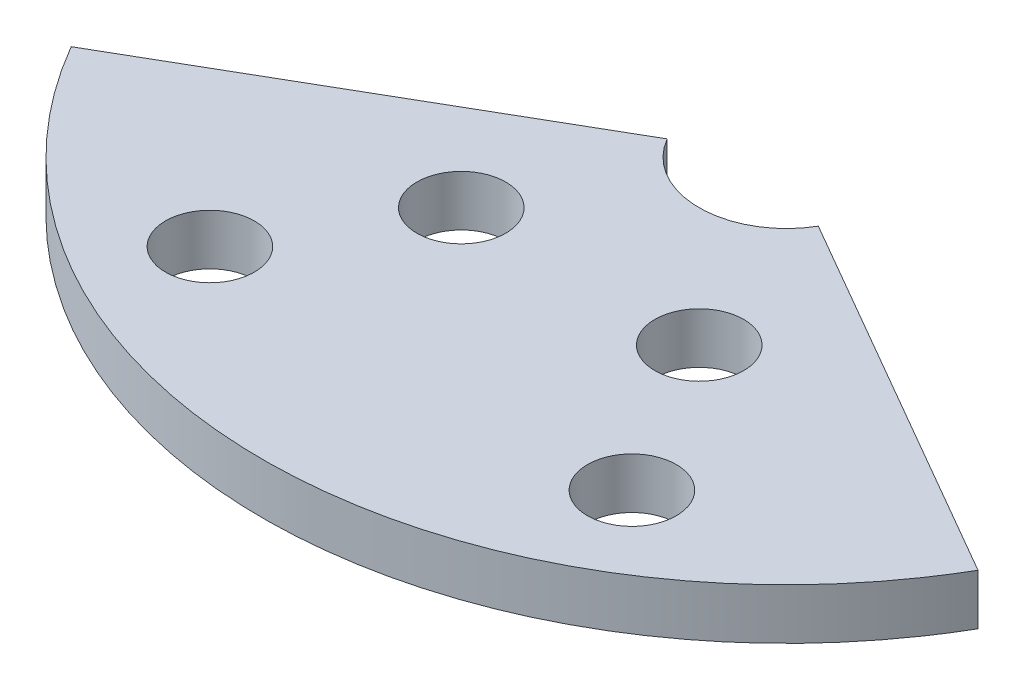
ISO-10303-21;
HEADER;
FILE_DESCRIPTION(('STEP AP214'),'2;1');
FILE_NAME('part.step','',(''),(''),'','','');
FILE_SCHEMA(('AUTOMOTIVE_DESIGN { 1 0 10303 214 1 1 1 1 }'));
ENDSEC;
DATA;
#1=APPLICATION_CONTEXT('core data for automotive mechanical design processes');
#2=APPLICATION_PROTOCOL_DEFINITION('international standard','automotive_design',2000,#1);
#3=PRODUCT_CONTEXT('',#1,'mechanical');
#4=PRODUCT('Part','Part','',(#3));
#5=PRODUCT_RELATED_PRODUCT_CATEGORY('part','',(#4));
#6=PRODUCT_DEFINITION_FORMATION('','',#4);
#7=PRODUCT_DEFINITION_CONTEXT('part definition',#1,'design');
#8=PRODUCT_DEFINITION('design','',#6,#7);
#9=PRODUCT_DEFINITION_SHAPE('','',#8);
#10=(LENGTH_UNIT() NAMED_UNIT(*) SI_UNIT(.MILLI.,.METRE.));
#11=(NAMED_UNIT(*) PLANE_ANGLE_UNIT() SI_UNIT($,.RADIAN.));
#12=(NAMED_UNIT(*) SI_UNIT($,.STERADIAN.) SOLID_ANGLE_UNIT());
#13=UNCERTAINTY_MEASURE_WITH_UNIT(LENGTH_MEASURE(1.E-05),#10,'distance_accuracy_value','');
#14=(GEOMETRIC_REPRESENTATION_CONTEXT(3) GLOBAL_UNCERTAINTY_ASSIGNED_CONTEXT((#13)) GLOBAL_UNIT_ASSIGNED_CONTEXT((#10,
#11,#12)) REPRESENTATION_CONTEXT('',''));
#15=CARTESIAN_POINT('',(0.,0.,0.));
#16=DIRECTION('',(0.,0.,1.));
#17=DIRECTION('',(1.,0.,0.));
#18=AXIS2_PLACEMENT_3D('',#15,#16,#17);
#19=CARTESIAN_POINT('',(0.,-6.744,0.));
#20=DIRECTION('',(0.,1.,0.));
#21=DIRECTION('',(-1.,0.,0.));
#22=AXIS2_PLACEMENT_3D('',#19,#20,#21);
#23=CYLINDRICAL_SURFACE('',#22,13.7501305084715);
#24=CARTESIAN_POINT('',(0.,1.256,0.));
#25=DIRECTION('',(0.,1.,0.));
#26=DIRECTION('',(-1.,0.,0.));
#27=AXIS2_PLACEMENT_3D('',#24,#25,#26);
#28=CIRCLE('',#27,13.7501305084715);
#29=CARTESIAN_POINT('',(-11.9079583334281,1.256,6.87507216902783));
#30=VERTEX_POINT('',#29);
#31=CARTESIAN_POINT('',(11.9079583334518,1.256,6.87507216898668));
#32=VERTEX_POINT('',#31);
#33=EDGE_CURVE('E111',#30,#32,#28,.T.);
#34=ORIENTED_EDGE('',*,*,#33,.T.);
#35=DIRECTION('',(0.,1.,0.));
#36=VECTOR('',#35,1.);
#37=CARTESIAN_POINT('',(11.9079583334518,-6.744,6.87507216898668));
#38=LINE('',#37,#36);
#39=CARTESIAN_POINT('',(11.9079583334518,-6.744,6.87507216898668));
#40=VERTEX_POINT('',#39);
#41=EDGE_CURVE('E11',#40,#32,#38,.T.);
#42=ORIENTED_EDGE('',*,*,#41,.F.);
#43=CARTESIAN_POINT('',(0.,-6.744,0.));
#44=DIRECTION('',(0.,1.,0.));
#45=DIRECTION('',(-1.,0.,0.));
#46=AXIS2_PLACEMENT_3D('',#43,#44,#45);
#47=CIRCLE('',#46,13.7501305084715);
#48=CARTESIAN_POINT('',(-11.9079583334281,-6.744,6.87507216902783));
#49=VERTEX_POINT('',#48);
#50=EDGE_CURVE('E80',#49,#40,#47,.T.);
#51=ORIENTED_EDGE('',*,*,#50,.F.);
#52=DIRECTION('',(0.,1.,0.));
#53=VECTOR('',#52,1.);
#54=CARTESIAN_POINT('',(-11.9079583334281,-6.744,6.87507216902783));
#55=LINE('',#54,#53);
#56=EDGE_CURVE('E47',#49,#30,#55,.T.);
#57=ORIENTED_EDGE('',*,*,#56,.T.);
#58=EDGE_LOOP('',(#34,#42,#51,#57));
#59=FACE_BOUND('',#58,.T.);
#60=ADVANCED_FACE('F31',(#59),#23,.F.);
#61=CARTESIAN_POINT('',(11.9079583334518,-6.744,6.87507216898668));
#62=DIRECTION('',(-0.500000502885533,0.,0.866025113443146));
#63=DIRECTION('',(0.866025113443146,0.,0.500000502885533));
#64=AXIS2_PLACEMENT_3D('',#61,#62,#63);
#65=PLANE('',#64);
#66=DIRECTION('',(0.866025113443146,0.,0.500000502885533));
#67=VECTOR('',#66,1.);
#68=CARTESIAN_POINT('',(11.9079583334518,1.256,6.87507216898668));
#69=LINE('',#68,#67);
#70=CARTESIAN_POINT('',(71.4469146029727,1.25600000000001,41.2499506961029));
#71=VERTEX_POINT('',#70);
#72=EDGE_CURVE('E85',#32,#71,#69,.T.);
#73=ORIENTED_EDGE('',*,*,#72,.T.);
#74=DIRECTION('',(0.,1.,0.));
#75=VECTOR('',#74,1.);
#76=CARTESIAN_POINT('',(71.4469146029727,-6.74399999999999,41.2499506961029));
#77=LINE('',#76,#75);
#78=CARTESIAN_POINT('',(71.4469146029727,-6.74399999999999,41.2499506961029));
#79=VERTEX_POINT('',#78);
#80=EDGE_CURVE('E39',#79,#71,#77,.T.);
#81=ORIENTED_EDGE('',*,*,#80,.F.);
#82=DIRECTION('',(0.866025113443146,0.,0.500000502885533));
#83=VECTOR('',#82,1.);
#84=CARTESIAN_POINT('',(11.9079583334518,-6.744,6.87507216898668));
#85=LINE('',#84,#83);
#86=EDGE_CURVE('E72',#40,#79,#85,.T.);
#87=ORIENTED_EDGE('',*,*,#86,.F.);
#88=ORIENTED_EDGE('',*,*,#41,.T.);
#89=EDGE_LOOP('',(#73,#81,#87,#88));
#90=FACE_BOUND('',#89,.T.);
#91=ADVANCED_FACE('F84',(#90),#65,.F.);
#92=CARTESIAN_POINT('',(-71.4471176254403,-6.74400000000001,41.2500679081568));
#93=CARTESIAN_POINT('',(-71.3661601771251,-6.74400000000001,41.3902861155633));
#94=CARTESIAN_POINT('',(-70.3091616544968,-6.744,43.2085444675748));
#95=CARTESIAN_POINT('',(-68.1420010306818,-6.744,46.6264076369609));
#96=CARTESIAN_POINT('',(-64.6850825574709,-6.744,51.3179603314155));
#97=CARTESIAN_POINT('',(-60.9033093758443,-6.744,55.7522030200757));
#98=CARTESIAN_POINT('',(-56.8191451499,-6.744,59.9098103839806));
#99=CARTESIAN_POINT('',(-52.4517263648933,-6.744,63.768931064706));
#100=CARTESIAN_POINT('',(-47.822687052309,-6.744,67.30986258579));
#101=CARTESIAN_POINT('',(-42.9556133815968,-6.744,70.515547404472));
#102=CARTESIAN_POINT('',(-37.8747792068427,-6.744,73.3700076913245));
#103=CARTESIAN_POINT('',(-32.6045145678455,-6.744,75.8577645515811));
#104=CARTESIAN_POINT('',(-27.1728427633841,-6.744,77.9699279752762));
#105=CARTESIAN_POINT('',(-21.6048219411377,-6.744,79.6922881272113));
#106=CARTESIAN_POINT('',(-15.9295841311975,-6.744,81.0170047138531));
#107=CARTESIAN_POINT('',(-10.1750273860372,-6.744,81.9392518811265));
#108=CARTESIAN_POINT('',(-4.36985543928022,-6.744,82.4522864580724));
#109=CARTESIAN_POINT('',(1.45727600922675,-6.744,82.5555529907772));
#110=CARTESIAN_POINT('',(7.27716254939578,-6.744,82.2474824649832));
#111=CARTESIAN_POINT('',(13.0604419052198,-6.74399999999999,81.5285005086178));
#112=CARTESIAN_POINT('',(18.7791430058164,-6.74399999999999,80.4048084369535));
#113=CARTESIAN_POINT('',(24.4037476155964,-6.74399999999999,78.8796274218153));
#114=CARTESIAN_POINT('',(29.9069558527534,-6.74399999999999,76.9615929650851));
#115=CARTESIAN_POINT('',(35.2616139170664,-6.74399999999999,74.6615175656854));
#116=CARTESIAN_POINT('',(40.439320096809,-6.74399999999999,71.9859947428277));
#117=CARTESIAN_POINT('',(45.4178044007229,-6.74399999999999,68.9561290954584));
#118=CARTESIAN_POINT('',(50.1675817506521,-6.74399999999999,65.578718514889));
#119=CARTESIAN_POINT('',(54.6694319325816,-6.74399999999999,61.877793260476));
#120=CARTESIAN_POINT('',(58.8978064634218,-6.74399999999999,57.866905616755));
#121=CARTESIAN_POINT('',(62.8333405564802,-6.74399999999999,53.5685725964528));
#122=CARTESIAN_POINT('',(66.4548477985682,-6.74399999999999,49.0028018639444));
#123=CARTESIAN_POINT('',(69.2891848353224,-6.74399999999999,44.861425580242));
#124=CARTESIAN_POINT('',(70.880649196064,-6.74399999999999,42.230909650586));
#125=CARTESIAN_POINT('',(71.4469146029727,-6.74399999999999,41.2499506961029));
#126=B_SPLINE_CURVE_WITH_KNOTS('',3,(#92,#93,#94,#95,#96,#97,#98,#99,#100,#101,#102,#103,#104,
#105,#106,#107,#108,#109,#110,#111,#112,#113,#114,#115,#116,#117,#118,#119,#120,#121,#122,#123,
#124,#125),.UNSPECIFIED.,.F.,.F.,(4,1,1,1,1,1,1,1,1,1,1,1,1,1,1,1,1,1,1,1,1,1,1,1,1,1,1,1,1,1,1,
4),(0.,0.00281118504864708,0.0365160998991901,0.0702222977075216,0.10392951498759,
0.137638338705647,0.171348631114215,0.205056357373021,0.238764038400629,0.272472641436815,
0.306176566075001,0.339887878328473,0.373595972896201,0.407306257849649,0.441009596399646,
0.474720653197788,0.508427496691702,0.542135729933407,0.575845591433321,0.609549057243366,
0.643261827145568,0.676965075221332,0.710672717976341,0.744381334432411,0.778092762485036,
0.811797295570405,0.845508270363994,0.879215303236783,0.912922820735709,0.946631012226169,
0.980334215064725,1.),.UNSPECIFIED.);
#127=DIRECTION('',(0.,1.,0.));
#128=VECTOR('',#127,1.);
#129=SURFACE_OF_LINEAR_EXTRUSION('',#126,#128);
#130=CARTESIAN_POINT('',(-71.4471176254403,1.256,41.2500679081568));
#131=CARTESIAN_POINT('',(-71.3661601771251,1.256,41.3902861155633));
#132=CARTESIAN_POINT('',(-70.3091616544968,1.256,43.2085444675748));
#133=CARTESIAN_POINT('',(-68.1420010306818,1.256,46.6264076369609));
#134=CARTESIAN_POINT('',(-64.6850825574709,1.256,51.3179603314155));
#135=CARTESIAN_POINT('',(-60.9033093758443,1.256,55.7522030200757));
#136=CARTESIAN_POINT('',(-56.8191451499,1.256,59.9098103839806));
#137=CARTESIAN_POINT('',(-52.4517263648933,1.256,63.768931064706));
#138=CARTESIAN_POINT('',(-47.822687052309,1.256,67.30986258579));
#139=CARTESIAN_POINT('',(-42.9556133815968,1.256,70.515547404472));
#140=CARTESIAN_POINT('',(-37.8747792068427,1.256,73.3700076913245));
#141=CARTESIAN_POINT('',(-32.6045145678455,1.256,75.8577645515811));
#142=CARTESIAN_POINT('',(-27.1728427633841,1.256,77.9699279752762));
#143=CARTESIAN_POINT('',(-21.6048219411377,1.256,79.6922881272113));
#144=CARTESIAN_POINT('',(-15.9295841311975,1.256,81.0170047138531));
#145=CARTESIAN_POINT('',(-10.1750273860372,1.256,81.9392518811265));
#146=CARTESIAN_POINT('',(-4.36985543928022,1.256,82.4522864580724));
#147=CARTESIAN_POINT('',(1.45727600922675,1.256,82.5555529907772));
#148=CARTESIAN_POINT('',(7.27716254939578,1.256,82.2474824649832));
#149=CARTESIAN_POINT('',(13.0604419052198,1.25600000000001,81.5285005086178));
#150=CARTESIAN_POINT('',(18.7791430058164,1.25600000000001,80.4048084369535));
#151=CARTESIAN_POINT('',(24.4037476155964,1.25600000000001,78.8796274218153));
#152=CARTESIAN_POINT('',(29.9069558527534,1.25600000000001,76.9615929650851));
#153=CARTESIAN_POINT('',(35.2616139170664,1.25600000000001,74.6615175656854));
#154=CARTESIAN_POINT('',(40.439320096809,1.25600000000001,71.9859947428277));
#155=CARTESIAN_POINT('',(45.4178044007229,1.25600000000001,68.9561290954584));
#156=CARTESIAN_POINT('',(50.1675817506521,1.25600000000001,65.578718514889));
#157=CARTESIAN_POINT('',(54.6694319325816,1.25600000000001,61.877793260476));
#158=CARTESIAN_POINT('',(58.8978064634218,1.25600000000001,57.866905616755));
#159=CARTESIAN_POINT('',(62.8333405564802,1.25600000000001,53.5685725964528));
#160=CARTESIAN_POINT('',(66.4548477985682,1.25600000000001,49.0028018639444));
#161=CARTESIAN_POINT('',(69.2891848353224,1.25600000000001,44.861425580242));
#162=CARTESIAN_POINT('',(70.880649196064,1.25600000000001,42.230909650586));
#163=CARTESIAN_POINT('',(71.4469146029727,1.25600000000001,41.2499506961029));
#164=B_SPLINE_CURVE_WITH_KNOTS('',3,(#130,#131,#132,#133,#134,#135,#136,#137,#138,#139,#140,
#141,#142,#143,#144,#145,#146,#147,#148,#149,#150,#151,#152,#153,#154,#155,#156,#157,#158,#159,
#160,#161,#162,#163),.UNSPECIFIED.,.F.,.F.,(4,1,1,1,1,1,1,1,1,1,1,1,1,1,1,1,1,1,1,1,1,1,1,1,1,1,
1,1,1,1,1,4),(0.,0.00281118504864708,0.0365160998991901,0.0702222977075216,0.10392951498759,
0.137638338705647,0.171348631114215,0.205056357373021,0.238764038400629,0.272472641436815,
0.306176566075001,0.339887878328473,0.373595972896201,0.407306257849649,0.441009596399646,
0.474720653197788,0.508427496691702,0.542135729933407,0.575845591433321,0.609549057243366,
0.643261827145568,0.676965075221332,0.710672717976341,0.744381334432411,0.778092762485036,
0.811797295570405,0.845508270363994,0.879215303236783,0.912922820735709,0.946631012226169,
0.980334215064725,1.),.UNSPECIFIED.);
#165=CARTESIAN_POINT('',(-71.4471176254403,1.256,41.2500679081568));
#166=VERTEX_POINT('',#165);
#167=EDGE_CURVE('E115',#166,#71,#164,.T.);
#168=ORIENTED_EDGE('',*,*,#167,.F.);
#169=DIRECTION('',(0.,1.,0.));
#170=VECTOR('',#169,1.);
#171=CARTESIAN_POINT('',(-71.4471176254403,-6.74400000000001,41.2500679081568));
#172=LINE('',#171,#170);
#173=CARTESIAN_POINT('',(-71.4471176254403,-6.74400000000001,41.2500679081568));
#174=VERTEX_POINT('',#173);
#175=EDGE_CURVE('E61',#174,#166,#172,.T.);
#176=ORIENTED_EDGE('',*,*,#175,.F.);
#177=EDGE_CURVE('E79',#174,#79,#126,.T.);
#178=ORIENTED_EDGE('',*,*,#177,.T.);
#179=ORIENTED_EDGE('',*,*,#80,.T.);
#180=EDGE_LOOP('',(#168,#176,#178,#179));
#181=FACE_BOUND('',#180,.T.);
#182=ADVANCED_FACE('F88',(#181),#129,.T.);
#183=CARTESIAN_POINT('',(-11.9079583334281,-6.744,6.87507216902783));
#184=DIRECTION('',(-0.500000502850248,0.,-0.866025113463518));
#185=DIRECTION('',(-0.866025113463518,0.,0.500000502850248));
#186=AXIS2_PLACEMENT_3D('',#183,#184,#185);
#187=PLANE('',#186);
#188=DIRECTION('',(-0.866025113463518,0.,0.500000502850248));
#189=VECTOR('',#188,1.);
#190=CARTESIAN_POINT('',(-11.9079583334281,1.256,6.87507216902783));
#191=LINE('',#190,#189);
#192=EDGE_CURVE('E124',#30,#166,#191,.T.);
#193=ORIENTED_EDGE('',*,*,#192,.F.);
#194=ORIENTED_EDGE('',*,*,#56,.F.);
#195=DIRECTION('',(-0.866025113463518,0.,0.500000502850248));
#196=VECTOR('',#195,1.);
#197=CARTESIAN_POINT('',(-11.9079583334281,-6.744,6.87507216902783));
#198=LINE('',#197,#196);
#199=EDGE_CURVE('E89',#49,#174,#198,.T.);
#200=ORIENTED_EDGE('',*,*,#199,.T.);
#201=ORIENTED_EDGE('',*,*,#175,.T.);
#202=EDGE_LOOP('',(#193,#194,#200,#201));
#203=FACE_BOUND('',#202,.T.);
#204=ADVANCED_FACE('F103',(#203),#187,.T.);
#205=CARTESIAN_POINT('',(0.,-6.744,0.));
#206=DIRECTION('',(0.,1.,0.));
#207=DIRECTION('',(-1.,0.,0.));
#208=AXIS2_PLACEMENT_3D('',#205,#206,#207);
#209=PLANE('',#208);
#210=CARTESIAN_POINT('',(33.25,-6.74399999999999,57.591));
#211=DIRECTION('',(0.,1.,0.));
#212=DIRECTION('',(-1.,0.,0.));
#213=AXIS2_PLACEMENT_3D('',#210,#211,#212);
#214=CIRCLE('',#213,6.99984599830595);
#215=CARTESIAN_POINT('',(26.250154001694,-6.74399999999999,57.591));
#216=VERTEX_POINT('',#215);
#217=EDGE_CURVE('E143',#216,#216,#214,.T.);
#218=ORIENTED_EDGE('',*,*,#217,.T.);
#219=EDGE_LOOP('',(#218));
#220=FACE_BOUND('',#219,.T.);
#221=CARTESIAN_POINT('',(18.75,-6.744,32.476));
#222=DIRECTION('',(0.,1.,0.));
#223=DIRECTION('',(-1.,0.,0.));
#224=AXIS2_PLACEMENT_3D('',#221,#222,#223);
#225=CIRCLE('',#224,6.99984599830597);
#226=CARTESIAN_POINT('',(11.750154001694,-6.744,32.476));
#227=VERTEX_POINT('',#226);
#228=EDGE_CURVE('E137',#227,#227,#225,.T.);
#229=ORIENTED_EDGE('',*,*,#228,.T.);
#230=EDGE_LOOP('',(#229));
#231=FACE_BOUND('',#230,.T.);
#232=CARTESIAN_POINT('',(-33.25,-6.744,57.591));
#233=DIRECTION('',(0.,1.,0.));
#234=DIRECTION('',(-1.,0.,0.));
#235=AXIS2_PLACEMENT_3D('',#232,#233,#234);
#236=CIRCLE('',#235,6.99984599830596);
#237=CARTESIAN_POINT('',(-40.249845998306,-6.744,57.591));
#238=VERTEX_POINT('',#237);
#239=EDGE_CURVE('E132',#238,#238,#236,.T.);
#240=ORIENTED_EDGE('',*,*,#239,.T.);
#241=EDGE_LOOP('',(#240));
#242=FACE_BOUND('',#241,.T.);
#243=CARTESIAN_POINT('',(-18.75,-6.744,32.476));
#244=DIRECTION('',(0.,1.,0.));
#245=DIRECTION('',(-1.,0.,0.));
#246=AXIS2_PLACEMENT_3D('',#243,#244,#245);
#247=CIRCLE('',#246,6.99984599830597);
#248=CARTESIAN_POINT('',(-25.749845998306,-6.744,32.476));
#249=VERTEX_POINT('',#248);
#250=EDGE_CURVE('E114',#249,#249,#247,.T.);
#251=ORIENTED_EDGE('',*,*,#250,.T.);
#252=EDGE_LOOP('',(#251));
#253=FACE_BOUND('',#252,.T.);
#254=ORIENTED_EDGE('',*,*,#50,.T.);
#255=ORIENTED_EDGE('',*,*,#86,.T.);
#256=ORIENTED_EDGE('',*,*,#177,.F.);
#257=ORIENTED_EDGE('',*,*,#199,.F.);
#258=EDGE_LOOP('',(#254,#255,#256,#257));
#259=FACE_BOUND('',#258,.T.);
#260=ADVANCED_FACE('F76',(#220,#231,#242,#253,#259),#209,.F.);
#261=CARTESIAN_POINT('',(0.,1.256,0.));
#262=DIRECTION('',(0.,1.,0.));
#263=DIRECTION('',(-1.,0.,0.));
#264=AXIS2_PLACEMENT_3D('',#261,#262,#263);
#265=PLANE('',#264);
#266=CARTESIAN_POINT('',(33.25,1.25600000000001,57.591));
#267=DIRECTION('',(0.,1.,0.));
#268=DIRECTION('',(-1.,0.,0.));
#269=AXIS2_PLACEMENT_3D('',#266,#267,#268);
#270=CIRCLE('',#269,6.99984599830595);
#271=CARTESIAN_POINT('',(26.250154001694,1.25600000000001,57.591));
#272=VERTEX_POINT('',#271);
#273=EDGE_CURVE('E146',#272,#272,#270,.T.);
#274=ORIENTED_EDGE('',*,*,#273,.F.);
#275=EDGE_LOOP('',(#274));
#276=FACE_BOUND('',#275,.T.);
#277=CARTESIAN_POINT('',(18.75,1.256,32.476));
#278=DIRECTION('',(0.,1.,0.));
#279=DIRECTION('',(-1.,0.,0.));
#280=AXIS2_PLACEMENT_3D('',#277,#278,#279);
#281=CIRCLE('',#280,6.99984599830597);
#282=CARTESIAN_POINT('',(11.750154001694,1.256,32.476));
#283=VERTEX_POINT('',#282);
#284=EDGE_CURVE('E140',#283,#283,#281,.T.);
#285=ORIENTED_EDGE('',*,*,#284,.F.);
#286=EDGE_LOOP('',(#285));
#287=FACE_BOUND('',#286,.T.);
#288=CARTESIAN_POINT('',(-33.25,1.256,57.591));
#289=DIRECTION('',(0.,1.,0.));
#290=DIRECTION('',(-1.,0.,0.));
#291=AXIS2_PLACEMENT_3D('',#288,#289,#290);
#292=CIRCLE('',#291,6.99984599830596);
#293=CARTESIAN_POINT('',(-40.249845998306,1.256,57.591));
#294=VERTEX_POINT('',#293);
#295=EDGE_CURVE('E134',#294,#294,#292,.T.);
#296=ORIENTED_EDGE('',*,*,#295,.F.);
#297=EDGE_LOOP('',(#296));
#298=FACE_BOUND('',#297,.T.);
#299=CARTESIAN_POINT('',(-18.75,1.256,32.476));
#300=DIRECTION('',(0.,1.,0.));
#301=DIRECTION('',(-1.,0.,0.));
#302=AXIS2_PLACEMENT_3D('',#299,#300,#301);
#303=CIRCLE('',#302,6.99984599830597);
#304=CARTESIAN_POINT('',(-25.749845998306,1.256,32.476));
#305=VERTEX_POINT('',#304);
#306=EDGE_CURVE('E118',#305,#305,#303,.T.);
#307=ORIENTED_EDGE('',*,*,#306,.F.);
#308=EDGE_LOOP('',(#307));
#309=FACE_BOUND('',#308,.T.);
#310=ORIENTED_EDGE('',*,*,#33,.F.);
#311=ORIENTED_EDGE('',*,*,#192,.T.);
#312=ORIENTED_EDGE('',*,*,#167,.T.);
#313=ORIENTED_EDGE('',*,*,#72,.F.);
#314=EDGE_LOOP('',(#310,#311,#312,#313));
#315=FACE_BOUND('',#314,.T.);
#316=ADVANCED_FACE('F161',(#276,#287,#298,#309,#315),#265,.T.);
#317=CARTESIAN_POINT('',(-18.75,-6.744,32.476));
#318=DIRECTION('',(0.,1.,0.));
#319=DIRECTION('',(-1.,0.,0.));
#320=AXIS2_PLACEMENT_3D('',#317,#318,#319);
#321=CYLINDRICAL_SURFACE('',#320,6.99984599830597);
#322=ORIENTED_EDGE('',*,*,#250,.F.);
#323=EDGE_LOOP('',(#322));
#324=FACE_BOUND('',#323,.T.);
#325=ORIENTED_EDGE('',*,*,#306,.T.);
#326=EDGE_LOOP('',(#325));
#327=FACE_BOUND('',#326,.T.);
#328=ADVANCED_FACE('F164',(#324,#327),#321,.F.);
#329=CARTESIAN_POINT('',(-33.25,-6.744,57.591));
#330=DIRECTION('',(0.,1.,0.));
#331=DIRECTION('',(-1.,0.,0.));
#332=AXIS2_PLACEMENT_3D('',#329,#330,#331);
#333=CYLINDRICAL_SURFACE('',#332,6.99984599830596);
#334=ORIENTED_EDGE('',*,*,#239,.F.);
#335=EDGE_LOOP('',(#334));
#336=FACE_BOUND('',#335,.T.);
#337=ORIENTED_EDGE('',*,*,#295,.T.);
#338=EDGE_LOOP('',(#337));
#339=FACE_BOUND('',#338,.T.);
#340=ADVANCED_FACE('F172',(#336,#339),#333,.F.);
#341=CARTESIAN_POINT('',(18.75,-6.744,32.476));
#342=DIRECTION('',(0.,1.,0.));
#343=DIRECTION('',(-1.,0.,0.));
#344=AXIS2_PLACEMENT_3D('',#341,#342,#343);
#345=CYLINDRICAL_SURFACE('',#344,6.99984599830597);
#346=ORIENTED_EDGE('',*,*,#228,.F.);
#347=EDGE_LOOP('',(#346));
#348=FACE_BOUND('',#347,.T.);
#349=ORIENTED_EDGE('',*,*,#284,.T.);
#350=EDGE_LOOP('',(#349));
#351=FACE_BOUND('',#350,.T.);
#352=ADVANCED_FACE('F157',(#348,#351),#345,.F.);
#353=CARTESIAN_POINT('',(33.25,-6.74399999999999,57.591));
#354=DIRECTION('',(0.,1.,0.));
#355=DIRECTION('',(-1.,0.,0.));
#356=AXIS2_PLACEMENT_3D('',#353,#354,#355);
#357=CYLINDRICAL_SURFACE('',#356,6.99984599830595);
#358=ORIENTED_EDGE('',*,*,#217,.F.);
#359=EDGE_LOOP('',(#358));
#360=FACE_BOUND('',#359,.T.);
#361=ORIENTED_EDGE('',*,*,#273,.T.);
#362=EDGE_LOOP('',(#361));
#363=FACE_BOUND('',#362,.T.);
#364=ADVANCED_FACE('F154',(#360,#363),#357,.F.);
#365=CLOSED_SHELL('',(#60,#91,#182,#204,#260,#316,#328,#340,#352,#364));
#366=MANIFOLD_SOLID_BREP('B2',#365);
#367=ADVANCED_BREP_SHAPE_REPRESENTATION('',(#18,#366),#14);
#368=SHAPE_DEFINITION_REPRESENTATION(#9,#367);
ENDSEC;
END-ISO-10303-21;
